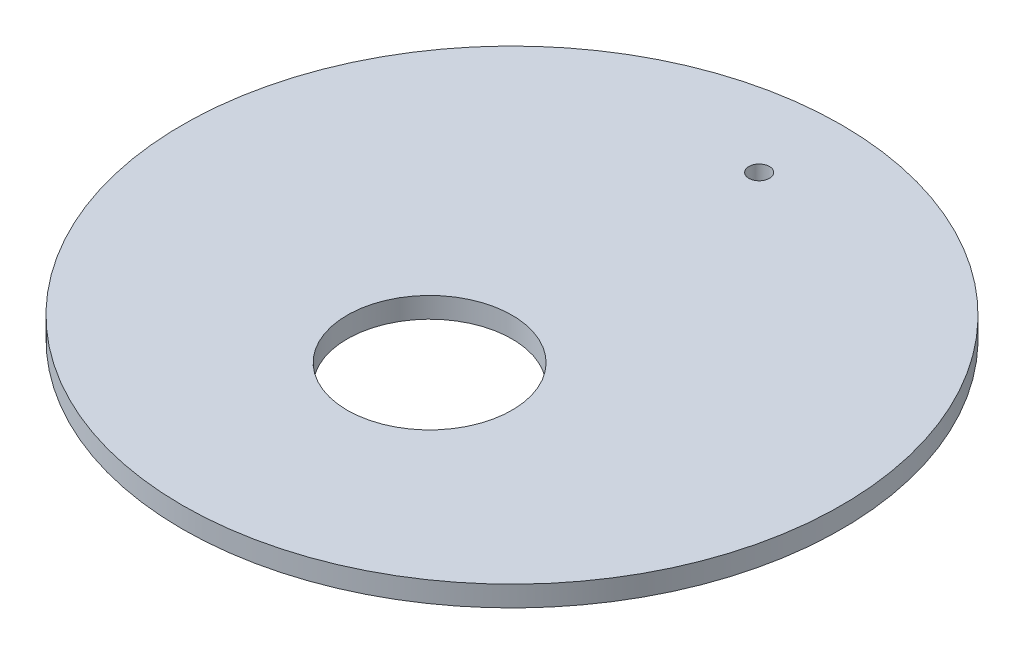
ISO-10303-21;
HEADER;
FILE_DESCRIPTION(('STEP AP214'),'2;1');
FILE_NAME('part.step','',(''),(''),'','','');
FILE_SCHEMA(('AUTOMOTIVE_DESIGN { 1 0 10303 214 1 1 1 1 }'));
ENDSEC;
DATA;
#1=APPLICATION_CONTEXT('core data for automotive mechanical design processes');
#2=APPLICATION_PROTOCOL_DEFINITION('international standard','automotive_design',2000,#1);
#3=PRODUCT_CONTEXT('',#1,'mechanical');
#4=PRODUCT('Part','Part','',(#3));
#5=PRODUCT_RELATED_PRODUCT_CATEGORY('part','',(#4));
#6=PRODUCT_DEFINITION_FORMATION('','',#4);
#7=PRODUCT_DEFINITION_CONTEXT('part definition',#1,'design');
#8=PRODUCT_DEFINITION('design','',#6,#7);
#9=PRODUCT_DEFINITION_SHAPE('','',#8);
#10=(LENGTH_UNIT() NAMED_UNIT(*) SI_UNIT(.MILLI.,.METRE.));
#11=(NAMED_UNIT(*) PLANE_ANGLE_UNIT() SI_UNIT($,.RADIAN.));
#12=(NAMED_UNIT(*) SI_UNIT($,.STERADIAN.) SOLID_ANGLE_UNIT());
#13=UNCERTAINTY_MEASURE_WITH_UNIT(LENGTH_MEASURE(1.E-05),#10,'distance_accuracy_value','');
#14=(GEOMETRIC_REPRESENTATION_CONTEXT(3) GLOBAL_UNCERTAINTY_ASSIGNED_CONTEXT((#13)) GLOBAL_UNIT_ASSIGNED_CONTEXT((#10,
#11,#12)) REPRESENTATION_CONTEXT('',''));
#15=CARTESIAN_POINT('',(0.,0.,0.));
#16=DIRECTION('',(0.,0.,1.));
#17=DIRECTION('',(1.,0.,0.));
#18=AXIS2_PLACEMENT_3D('',#15,#16,#17);
#19=CARTESIAN_POINT('',(0.,6.35,0.));
#20=DIRECTION('',(0.,-1.,0.));
#21=DIRECTION('',(0.,0.,-1.));
#22=AXIS2_PLACEMENT_3D('',#19,#20,#21);
#23=CYLINDRICAL_SURFACE('',#22,101.6);
#24=CARTESIAN_POINT('',(0.,6.35,0.));
#25=DIRECTION('',(0.,1.,0.));
#26=DIRECTION('',(0.,0.,1.));
#27=AXIS2_PLACEMENT_3D('',#24,#25,#26);
#28=CIRCLE('',#27,101.6);
#29=CARTESIAN_POINT('',(0.,6.35,101.6));
#30=VERTEX_POINT('',#29);
#31=EDGE_CURVE('E10',#30,#30,#28,.T.);
#32=ORIENTED_EDGE('',*,*,#31,.F.);
#33=EDGE_LOOP('',(#32));
#34=FACE_BOUND('',#33,.T.);
#35=CARTESIAN_POINT('',(0.,0.,0.));
#36=DIRECTION('',(0.,1.,0.));
#37=DIRECTION('',(0.,0.,1.));
#38=AXIS2_PLACEMENT_3D('',#35,#36,#37);
#39=CIRCLE('',#38,101.6);
#40=CARTESIAN_POINT('',(0.,0.,101.6));
#41=VERTEX_POINT('',#40);
#42=EDGE_CURVE('E45',#41,#41,#39,.T.);
#43=ORIENTED_EDGE('',*,*,#42,.T.);
#44=EDGE_LOOP('',(#43));
#45=FACE_BOUND('',#44,.T.);
#46=ADVANCED_FACE('F38',(#34,#45),#23,.T.);
#47=CARTESIAN_POINT('',(0.,6.35,0.));
#48=DIRECTION('',(0.,1.,0.));
#49=DIRECTION('',(0.,0.,1.));
#50=AXIS2_PLACEMENT_3D('',#47,#48,#49);
#51=PLANE('',#50);
#52=CARTESIAN_POINT('',(0.,6.35,-76.2));
#53=DIRECTION('',(0.,1.,0.));
#54=DIRECTION('',(0.,0.,1.));
#55=AXIS2_PLACEMENT_3D('',#52,#53,#54);
#56=CIRCLE('',#55,3.175);
#57=CARTESIAN_POINT('',(0.,6.35,-73.025));
#58=VERTEX_POINT('',#57);
#59=EDGE_CURVE('E62',#58,#58,#56,.T.);
#60=ORIENTED_EDGE('',*,*,#59,.F.);
#61=EDGE_LOOP('',(#60));
#62=FACE_BOUND('',#61,.T.);
#63=CARTESIAN_POINT('',(0.,6.35,25.4));
#64=DIRECTION('',(0.,1.,0.));
#65=DIRECTION('',(0.,0.,1.));
#66=AXIS2_PLACEMENT_3D('',#63,#64,#65);
#67=CIRCLE('',#66,25.4);
#68=CARTESIAN_POINT('',(0.,6.35,50.8));
#69=VERTEX_POINT('',#68);
#70=EDGE_CURVE('E53',#69,#69,#67,.T.);
#71=ORIENTED_EDGE('',*,*,#70,.F.);
#72=EDGE_LOOP('',(#71));
#73=FACE_BOUND('',#72,.T.);
#74=ORIENTED_EDGE('',*,*,#31,.T.);
#75=EDGE_LOOP('',(#74));
#76=FACE_BOUND('',#75,.T.);
#77=ADVANCED_FACE('F71',(#62,#73,#76),#51,.T.);
#78=CARTESIAN_POINT('',(0.,0.,0.));
#79=DIRECTION('',(0.,1.,0.));
#80=DIRECTION('',(0.,0.,1.));
#81=AXIS2_PLACEMENT_3D('',#78,#79,#80);
#82=PLANE('',#81);
#83=CARTESIAN_POINT('',(0.,0.,-76.2));
#84=DIRECTION('',(0.,1.,0.));
#85=DIRECTION('',(0.,0.,1.));
#86=AXIS2_PLACEMENT_3D('',#83,#84,#85);
#87=CIRCLE('',#86,3.175);
#88=CARTESIAN_POINT('',(0.,0.,-73.025));
#89=VERTEX_POINT('',#88);
#90=EDGE_CURVE('E41',#89,#89,#87,.T.);
#91=ORIENTED_EDGE('',*,*,#90,.T.);
#92=EDGE_LOOP('',(#91));
#93=FACE_BOUND('',#92,.T.);
#94=CARTESIAN_POINT('',(0.,0.,25.4));
#95=DIRECTION('',(0.,1.,0.));
#96=DIRECTION('',(0.,0.,1.));
#97=AXIS2_PLACEMENT_3D('',#94,#95,#96);
#98=CIRCLE('',#97,25.4);
#99=CARTESIAN_POINT('',(0.,0.,50.8));
#100=VERTEX_POINT('',#99);
#101=EDGE_CURVE('E50',#100,#100,#98,.T.);
#102=ORIENTED_EDGE('',*,*,#101,.T.);
#103=EDGE_LOOP('',(#102));
#104=FACE_BOUND('',#103,.T.);
#105=ORIENTED_EDGE('',*,*,#42,.F.);
#106=EDGE_LOOP('',(#105));
#107=FACE_BOUND('',#106,.T.);
#108=ADVANCED_FACE('F74',(#93,#104,#107),#82,.F.);
#109=CARTESIAN_POINT('',(0.,-19.304,25.4));
#110=DIRECTION('',(0.,1.,0.));
#111=DIRECTION('',(0.,0.,1.));
#112=AXIS2_PLACEMENT_3D('',#109,#110,#111);
#113=CYLINDRICAL_SURFACE('',#112,25.4);
#114=ORIENTED_EDGE('',*,*,#70,.T.);
#115=EDGE_LOOP('',(#114));
#116=FACE_BOUND('',#115,.T.);
#117=ORIENTED_EDGE('',*,*,#101,.F.);
#118=EDGE_LOOP('',(#117));
#119=FACE_BOUND('',#118,.T.);
#120=ADVANCED_FACE('F80',(#116,#119),#113,.F.);
#121=CARTESIAN_POINT('',(0.,-19.304,-76.2));
#122=DIRECTION('',(0.,1.,0.));
#123=DIRECTION('',(0.,0.,1.));
#124=AXIS2_PLACEMENT_3D('',#121,#122,#123);
#125=CYLINDRICAL_SURFACE('',#124,3.175);
#126=ORIENTED_EDGE('',*,*,#59,.T.);
#127=EDGE_LOOP('',(#126));
#128=FACE_BOUND('',#127,.T.);
#129=ORIENTED_EDGE('',*,*,#90,.F.);
#130=EDGE_LOOP('',(#129));
#131=FACE_BOUND('',#130,.T.);
#132=ADVANCED_FACE('F68',(#128,#131),#125,.F.);
#133=CLOSED_SHELL('',(#46,#77,#108,#120,#132));
#134=MANIFOLD_SOLID_BREP('B2',#133);
#135=ADVANCED_BREP_SHAPE_REPRESENTATION('',(#18,#134),#14);
#136=SHAPE_DEFINITION_REPRESENTATION(#9,#135);
ENDSEC;
END-ISO-10303-21;
